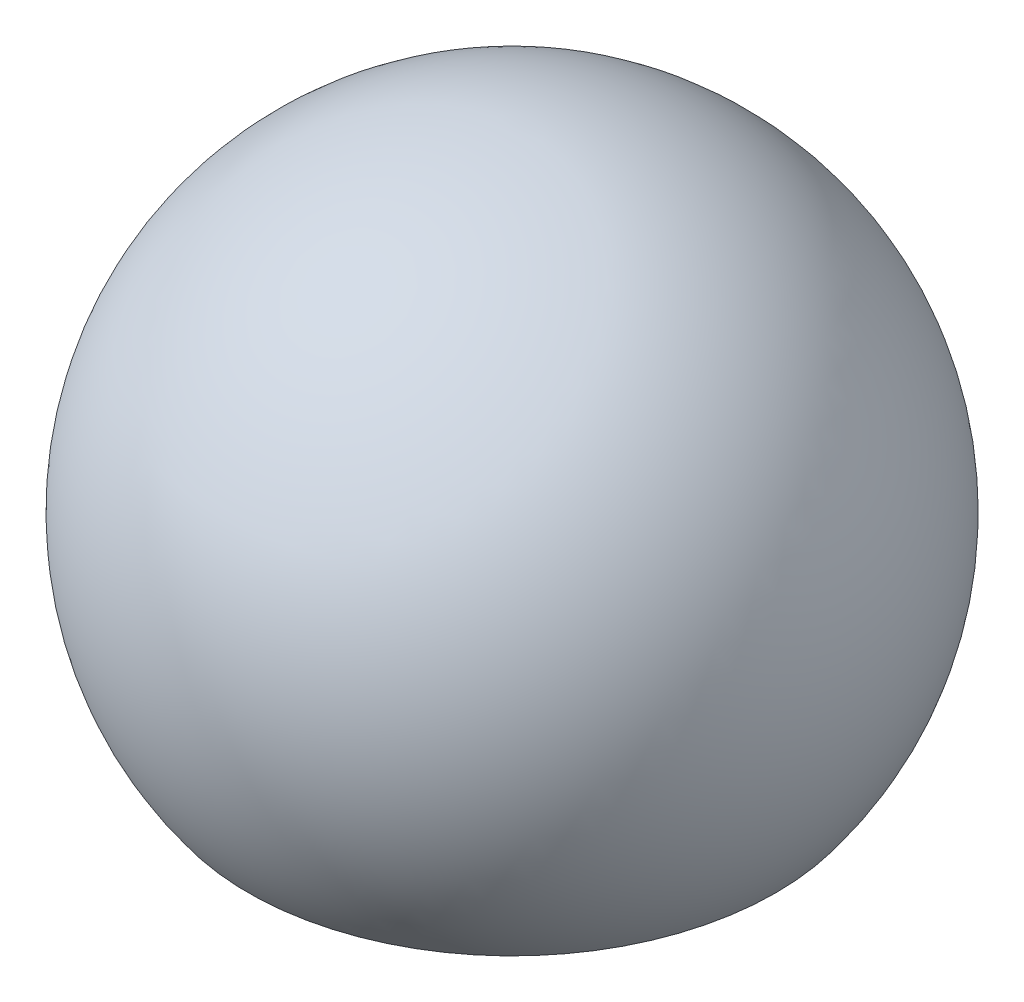
ISO-10303-21;
HEADER;
FILE_DESCRIPTION(('STEP AP214'),'2;1');
FILE_NAME('part.step','',(''),(''),'','','');
FILE_SCHEMA(('AUTOMOTIVE_DESIGN { 1 0 10303 214 1 1 1 1 }'));
ENDSEC;
DATA;
#1=APPLICATION_CONTEXT('core data for automotive mechanical design processes');
#2=APPLICATION_PROTOCOL_DEFINITION('international standard','automotive_design',2000,#1);
#3=PRODUCT_CONTEXT('',#1,'mechanical');
#4=PRODUCT('Part','Part','',(#3));
#5=PRODUCT_RELATED_PRODUCT_CATEGORY('part','',(#4));
#6=PRODUCT_DEFINITION_FORMATION('','',#4);
#7=PRODUCT_DEFINITION_CONTEXT('part definition',#1,'design');
#8=PRODUCT_DEFINITION('design','',#6,#7);
#9=PRODUCT_DEFINITION_SHAPE('','',#8);
#10=(LENGTH_UNIT() NAMED_UNIT(*) SI_UNIT(.MILLI.,.METRE.));
#11=(NAMED_UNIT(*) PLANE_ANGLE_UNIT() SI_UNIT($,.RADIAN.));
#12=(NAMED_UNIT(*) SI_UNIT($,.STERADIAN.) SOLID_ANGLE_UNIT());
#13=UNCERTAINTY_MEASURE_WITH_UNIT(LENGTH_MEASURE(1.E-05),#10,'distance_accuracy_value','');
#14=(GEOMETRIC_REPRESENTATION_CONTEXT(3) GLOBAL_UNCERTAINTY_ASSIGNED_CONTEXT((#13)) GLOBAL_UNIT_ASSIGNED_CONTEXT((#10,
#11,#12)) REPRESENTATION_CONTEXT('',''));
#15=CARTESIAN_POINT('',(0.,0.,0.));
#16=DIRECTION('',(0.,0.,1.));
#17=DIRECTION('',(1.,0.,0.));
#18=AXIS2_PLACEMENT_3D('',#15,#16,#17);
#19=CARTESIAN_POINT('',(0.,0.,0.));
#20=DIRECTION('',(0.,1.,0.));
#21=DIRECTION('',(1.,0.,0.));
#22=AXIS2_PLACEMENT_3D('',#19,#20,#21);
#23=SPHERICAL_SURFACE('',#22,0.25);
#24=CARTESIAN_POINT('',(0.,-0.15,0.));
#25=DIRECTION('',(0.,1.,0.));
#26=DIRECTION('',(-1.,0.,0.));
#27=AXIS2_PLACEMENT_3D('',#24,#25,#26);
#28=CIRCLE('',#27,0.2);
#29=CARTESIAN_POINT('',(-0.2,-0.15,0.));
#30=VERTEX_POINT('',#29);
#31=EDGE_CURVE('E10',#30,#30,#28,.T.);
#32=ORIENTED_EDGE('',*,*,#31,.T.);
#33=EDGE_LOOP('',(#32));
#34=FACE_BOUND('',#33,.T.);
#35=ADVANCED_FACE('F31',(#34),#23,.T.);
#36=CARTESIAN_POINT('',(0.,-0.15,0.));
#37=DIRECTION('',(0.,1.,0.));
#38=DIRECTION('',(-1.,0.,0.));
#39=AXIS2_PLACEMENT_3D('',#36,#37,#38);
#40=PLANE('',#39);
#41=ORIENTED_EDGE('',*,*,#31,.F.);
#42=EDGE_LOOP('',(#41));
#43=FACE_BOUND('',#42,.T.);
#44=ADVANCED_FACE('F39',(#43),#40,.F.);
#45=CLOSED_SHELL('',(#35,#44));
#46=MANIFOLD_SOLID_BREP('B2',#45);
#47=ADVANCED_BREP_SHAPE_REPRESENTATION('',(#18,#46),#14);
#48=SHAPE_DEFINITION_REPRESENTATION(#9,#47);
ENDSEC;
END-ISO-10303-21;
